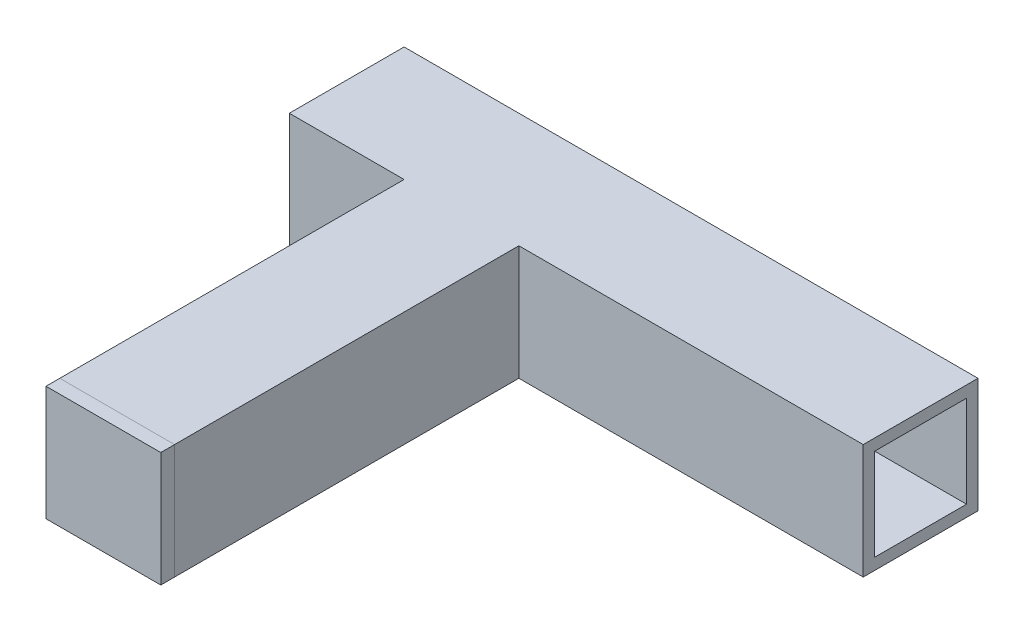
ISO-10303-21;
HEADER;
FILE_DESCRIPTION(('STEP AP214'),'2;1');
FILE_NAME('part.step','',(''),(''),'','','');
FILE_SCHEMA(('AUTOMOTIVE_DESIGN { 1 0 10303 214 1 1 1 1 }'));
ENDSEC;
DATA;
#1=APPLICATION_CONTEXT('core data for automotive mechanical design processes');
#2=APPLICATION_PROTOCOL_DEFINITION('international standard','automotive_design',2000,#1);
#3=PRODUCT_CONTEXT('',#1,'mechanical');
#4=PRODUCT('Part','Part','',(#3));
#5=PRODUCT_RELATED_PRODUCT_CATEGORY('part','',(#4));
#6=PRODUCT_DEFINITION_FORMATION('','',#4);
#7=PRODUCT_DEFINITION_CONTEXT('part definition',#1,'design');
#8=PRODUCT_DEFINITION('design','',#6,#7);
#9=PRODUCT_DEFINITION_SHAPE('','',#8);
#10=(LENGTH_UNIT() NAMED_UNIT(*) SI_UNIT(.MILLI.,.METRE.));
#11=(NAMED_UNIT(*) PLANE_ANGLE_UNIT() SI_UNIT($,.RADIAN.));
#12=(NAMED_UNIT(*) SI_UNIT($,.STERADIAN.) SOLID_ANGLE_UNIT());
#13=UNCERTAINTY_MEASURE_WITH_UNIT(LENGTH_MEASURE(1.E-05),#10,'distance_accuracy_value','');
#14=(GEOMETRIC_REPRESENTATION_CONTEXT(3) GLOBAL_UNCERTAINTY_ASSIGNED_CONTEXT((#13)) GLOBAL_UNIT_ASSIGNED_CONTEXT((#10,
#11,#12)) REPRESENTATION_CONTEXT('',''));
#15=CARTESIAN_POINT('',(0.,0.,0.));
#16=DIRECTION('',(0.,0.,1.));
#17=DIRECTION('',(1.,0.,0.));
#18=AXIS2_PLACEMENT_3D('',#15,#16,#17);
#19=CARTESIAN_POINT('',(125.,175.,25.));
#20=DIRECTION('',(0.,0.,1.));
#21=DIRECTION('',(1.,0.,0.));
#22=AXIS2_PLACEMENT_3D('',#19,#20,#21);
#23=PLANE('',#22);
#24=DIRECTION('',(0.,-1.,0.));
#25=VECTOR('',#24,1.);
#26=CARTESIAN_POINT('',(175.,225.,25.));
#27=LINE('',#26,#25);
#28=CARTESIAN_POINT('',(175.,225.,25.));
#29=VERTEX_POINT('',#28);
#30=CARTESIAN_POINT('',(175.,175.,25.));
#31=VERTEX_POINT('',#30);
#32=EDGE_CURVE('E66',#29,#31,#27,.T.);
#33=ORIENTED_EDGE('',*,*,#32,.F.);
#34=DIRECTION('',(1.,0.,0.));
#35=VECTOR('',#34,1.);
#36=CARTESIAN_POINT('',(125.,225.,25.));
#37=LINE('',#36,#35);
#38=CARTESIAN_POINT('',(125.,225.,25.));
#39=VERTEX_POINT('',#38);
#40=EDGE_CURVE('E334',#39,#29,#37,.T.);
#41=ORIENTED_EDGE('',*,*,#40,.F.);
#42=DIRECTION('',(0.,-1.,0.));
#43=VECTOR('',#42,1.);
#44=CARTESIAN_POINT('',(125.,175.,25.));
#45=LINE('',#44,#43);
#46=CARTESIAN_POINT('',(125.,175.,25.));
#47=VERTEX_POINT('',#46);
#48=EDGE_CURVE('E330',#39,#47,#45,.T.);
#49=ORIENTED_EDGE('',*,*,#48,.T.);
#50=DIRECTION('',(1.,0.,0.));
#51=VECTOR('',#50,1.);
#52=CARTESIAN_POINT('',(125.,175.,25.));
#53=LINE('',#52,#51);
#54=EDGE_CURVE('E11',#47,#31,#53,.T.);
#55=ORIENTED_EDGE('',*,*,#54,.T.);
#56=EDGE_LOOP('',(#33,#41,#49,#55));
#57=FACE_BOUND('',#56,.T.);
#58=ADVANCED_FACE('F39',(#57),#23,.T.);
#59=CARTESIAN_POINT('',(125.,175.,25.));
#60=DIRECTION('',(0.,-1.,0.));
#61=DIRECTION('',(0.,0.,-1.));
#62=AXIS2_PLACEMENT_3D('',#59,#60,#61);
#63=PLANE('',#62);
#64=DIRECTION('',(1.,0.,0.));
#65=VECTOR('',#64,1.);
#66=CARTESIAN_POINT('',(125.,175.,-25.));
#67=LINE('',#66,#65);
#68=CARTESIAN_POINT('',(125.,175.,-25.));
#69=VERTEX_POINT('',#68);
#70=CARTESIAN_POINT('',(375.,175.,-24.9999999999999));
#71=VERTEX_POINT('',#70);
#72=EDGE_CURVE('E332',#69,#71,#67,.T.);
#73=ORIENTED_EDGE('',*,*,#72,.T.);
#74=DIRECTION('',(0.,0.,-1.));
#75=VECTOR('',#74,1.);
#76=CARTESIAN_POINT('',(375.,175.,25.));
#77=LINE('',#76,#75);
#78=CARTESIAN_POINT('',(375.,175.,25.));
#79=VERTEX_POINT('',#78);
#80=EDGE_CURVE('E289',#79,#71,#77,.T.);
#81=ORIENTED_EDGE('',*,*,#80,.F.);
#82=CARTESIAN_POINT('',(225.,175.,25.));
#83=VERTEX_POINT('',#82);
#84=EDGE_CURVE('E51',#83,#79,#53,.T.);
#85=ORIENTED_EDGE('',*,*,#84,.F.);
#86=DIRECTION('',(0.,0.,-1.));
#87=VECTOR('',#86,1.);
#88=CARTESIAN_POINT('',(225.,175.,175.));
#89=LINE('',#88,#87);
#90=CARTESIAN_POINT('',(224.999975,175.000025,175.));
#91=VERTEX_POINT('',#90);
#92=EDGE_CURVE('E272',#91,#83,#89,.T.);
#93=ORIENTED_EDGE('',*,*,#92,.F.);
#94=CARTESIAN_POINT('',(175.00005,175.00005,175.));
#95=DIRECTION('',(1.,0.,0.));
#96=VECTOR('',#95,1.);
#97=LINE('',#94,#96);
#98=CARTESIAN_POINT('',(175.000025,175.000025,175.));
#99=VERTEX_POINT('',#98);
#100=EDGE_CURVE('E480',#99,#91,#97,.T.);
#101=ORIENTED_EDGE('',*,*,#100,.F.);
#102=DIRECTION('',(0.,0.,-1.));
#103=VECTOR('',#102,1.);
#104=CARTESIAN_POINT('',(175.,175.,175.));
#105=LINE('',#104,#103);
#106=EDGE_CURVE('E280',#99,#31,#105,.T.);
#107=ORIENTED_EDGE('',*,*,#106,.T.);
#108=ORIENTED_EDGE('',*,*,#54,.F.);
#109=DIRECTION('',(0.,0.,-1.));
#110=VECTOR('',#109,1.);
#111=CARTESIAN_POINT('',(125.,175.,25.));
#112=LINE('',#111,#110);
#113=EDGE_CURVE('E316',#47,#69,#112,.T.);
#114=ORIENTED_EDGE('',*,*,#113,.T.);
#115=EDGE_LOOP('',(#73,#81,#85,#93,#101,#107,#108,#114));
#116=FACE_BOUND('',#115,.T.);
#117=ADVANCED_FACE('F41',(#116),#63,.T.);
#118=DIRECTION('',(0.,1.,0.));
#119=VECTOR('',#118,1.);
#120=CARTESIAN_POINT('',(225.,225.,25.));
#121=LINE('',#120,#119);
#122=CARTESIAN_POINT('',(225.,225.,25.));
#123=VERTEX_POINT('',#122);
#124=EDGE_CURVE('E379',#83,#123,#121,.T.);
#125=ORIENTED_EDGE('',*,*,#124,.F.);
#126=ORIENTED_EDGE('',*,*,#84,.T.);
#127=DIRECTION('',(0.,-1.,0.));
#128=VECTOR('',#127,1.);
#129=CARTESIAN_POINT('',(375.,175.,25.));
#130=LINE('',#129,#128);
#131=CARTESIAN_POINT('',(375.,225.,25.0000000000001));
#132=VERTEX_POINT('',#131);
#133=EDGE_CURVE('E298',#132,#79,#130,.T.);
#134=ORIENTED_EDGE('',*,*,#133,.F.);
#135=EDGE_CURVE('E336',#123,#132,#37,.T.);
#136=ORIENTED_EDGE('',*,*,#135,.F.);
#137=EDGE_LOOP('',(#125,#126,#134,#136));
#138=FACE_BOUND('',#137,.T.);
#139=ADVANCED_FACE('F356',(#138),#23,.T.);
#140=CARTESIAN_POINT('',(125.,225.,25.));
#141=DIRECTION('',(0.,1.,0.));
#142=DIRECTION('',(0.,0.,1.));
#143=AXIS2_PLACEMENT_3D('',#140,#141,#142);
#144=PLANE('',#143);
#145=ORIENTED_EDGE('',*,*,#40,.T.);
#146=DIRECTION('',(0.,0.,-1.));
#147=VECTOR('',#146,1.);
#148=CARTESIAN_POINT('',(175.,225.,175.));
#149=LINE('',#148,#147);
#150=CARTESIAN_POINT('',(175.000025,224.999975,175.));
#151=VERTEX_POINT('',#150);
#152=EDGE_CURVE('E273',#151,#29,#149,.T.);
#153=ORIENTED_EDGE('',*,*,#152,.F.);
#154=CARTESIAN_POINT('',(224.99995,224.99995,175.));
#155=DIRECTION('',(-1.,0.,0.));
#156=VECTOR('',#155,1.);
#157=LINE('',#154,#156);
#158=CARTESIAN_POINT('',(224.999975,224.999975,175.));
#159=VERTEX_POINT('',#158);
#160=EDGE_CURVE('E212',#159,#151,#157,.T.);
#161=ORIENTED_EDGE('',*,*,#160,.F.);
#162=DIRECTION('',(0.,0.,-1.));
#163=VECTOR('',#162,1.);
#164=CARTESIAN_POINT('',(225.,225.,175.));
#165=LINE('',#164,#163);
#166=EDGE_CURVE('E264',#159,#123,#165,.T.);
#167=ORIENTED_EDGE('',*,*,#166,.T.);
#168=ORIENTED_EDGE('',*,*,#135,.T.);
#169=DIRECTION('',(0.,0.,1.));
#170=VECTOR('',#169,1.);
#171=CARTESIAN_POINT('',(375.,225.,25.0000000000001));
#172=LINE('',#171,#170);
#173=CARTESIAN_POINT('',(375.,225.,-24.9999999999999));
#174=VERTEX_POINT('',#173);
#175=EDGE_CURVE('E295',#174,#132,#172,.T.);
#176=ORIENTED_EDGE('',*,*,#175,.F.);
#177=DIRECTION('',(1.,0.,0.));
#178=VECTOR('',#177,1.);
#179=CARTESIAN_POINT('',(125.,225.,-24.9999999999999));
#180=LINE('',#179,#178);
#181=CARTESIAN_POINT('',(125.,225.,-24.9999999999999));
#182=VERTEX_POINT('',#181);
#183=EDGE_CURVE('E337',#182,#174,#180,.T.);
#184=ORIENTED_EDGE('',*,*,#183,.F.);
#185=DIRECTION('',(0.,0.,1.));
#186=VECTOR('',#185,1.);
#187=CARTESIAN_POINT('',(125.,225.,25.));
#188=LINE('',#187,#186);
#189=EDGE_CURVE('E327',#182,#39,#188,.T.);
#190=ORIENTED_EDGE('',*,*,#189,.T.);
#191=EDGE_LOOP('',(#145,#153,#161,#167,#168,#176,#184,#190));
#192=FACE_BOUND('',#191,.T.);
#193=ADVANCED_FACE('F346',(#192),#144,.T.);
#194=CARTESIAN_POINT('',(125.,175.,-25.));
#195=DIRECTION('',(0.,0.,-1.));
#196=DIRECTION('',(-1.,0.,0.));
#197=AXIS2_PLACEMENT_3D('',#194,#195,#196);
#198=PLANE('',#197);
#199=ORIENTED_EDGE('',*,*,#183,.T.);
#200=DIRECTION('',(0.,1.,0.));
#201=VECTOR('',#200,1.);
#202=CARTESIAN_POINT('',(375.,175.,-24.9999999999999));
#203=LINE('',#202,#201);
#204=EDGE_CURVE('E292',#71,#174,#203,.T.);
#205=ORIENTED_EDGE('',*,*,#204,.F.);
#206=ORIENTED_EDGE('',*,*,#72,.F.);
#207=DIRECTION('',(0.,1.,0.));
#208=VECTOR('',#207,1.);
#209=CARTESIAN_POINT('',(125.,175.,-25.));
#210=LINE('',#209,#208);
#211=EDGE_CURVE('E324',#69,#182,#210,.T.);
#212=ORIENTED_EDGE('',*,*,#211,.T.);
#213=EDGE_LOOP('',(#199,#205,#206,#212));
#214=FACE_BOUND('',#213,.T.);
#215=ADVANCED_FACE('F355',(#214),#198,.T.);
#216=CARTESIAN_POINT('',(125.,200.,0.));
#217=DIRECTION('',(1.,0.,0.));
#218=DIRECTION('',(0.,1.,0.));
#219=AXIS2_PLACEMENT_3D('',#216,#217,#218);
#220=PLANE('',#219);
#221=DIRECTION('',(0.,0.,1.));
#222=VECTOR('',#221,1.);
#223=CARTESIAN_POINT('',(125.,220.,20.));
#224=LINE('',#223,#222);
#225=CARTESIAN_POINT('',(125.,220.,-19.9999999999999));
#226=VERTEX_POINT('',#225);
#227=CARTESIAN_POINT('',(125.,220.,20.));
#228=VERTEX_POINT('',#227);
#229=EDGE_CURVE('E310',#226,#228,#224,.T.);
#230=ORIENTED_EDGE('',*,*,#229,.T.);
#231=DIRECTION('',(0.,-1.,0.));
#232=VECTOR('',#231,1.);
#233=CARTESIAN_POINT('',(125.,180.,20.));
#234=LINE('',#233,#232);
#235=CARTESIAN_POINT('',(125.,180.,20.));
#236=VERTEX_POINT('',#235);
#237=EDGE_CURVE('E301',#228,#236,#234,.T.);
#238=ORIENTED_EDGE('',*,*,#237,.T.);
#239=DIRECTION('',(0.,0.,-1.));
#240=VECTOR('',#239,1.);
#241=CARTESIAN_POINT('',(125.,180.,20.));
#242=LINE('',#241,#240);
#243=CARTESIAN_POINT('',(125.,180.,-20.));
#244=VERTEX_POINT('',#243);
#245=EDGE_CURVE('E304',#236,#244,#242,.T.);
#246=ORIENTED_EDGE('',*,*,#245,.T.);
#247=DIRECTION('',(0.,1.,0.));
#248=VECTOR('',#247,1.);
#249=CARTESIAN_POINT('',(125.,180.,-20.));
#250=LINE('',#249,#248);
#251=EDGE_CURVE('E307',#244,#226,#250,.T.);
#252=ORIENTED_EDGE('',*,*,#251,.T.);
#253=EDGE_LOOP('',(#230,#238,#246,#252));
#254=FACE_BOUND('',#253,.T.);
#255=ORIENTED_EDGE('',*,*,#113,.F.);
#256=ORIENTED_EDGE('',*,*,#48,.F.);
#257=ORIENTED_EDGE('',*,*,#189,.F.);
#258=ORIENTED_EDGE('',*,*,#211,.F.);
#259=EDGE_LOOP('',(#255,#256,#257,#258));
#260=FACE_BOUND('',#259,.T.);
#261=ADVANCED_FACE('F359',(#254,#260),#220,.F.);
#262=CARTESIAN_POINT('',(125.,180.,20.));
#263=DIRECTION('',(0.,0.,1.));
#264=DIRECTION('',(1.,0.,0.));
#265=AXIS2_PLACEMENT_3D('',#262,#263,#264);
#266=PLANE('',#265);
#267=DIRECTION('',(1.,0.,0.));
#268=VECTOR('',#267,1.);
#269=CARTESIAN_POINT('',(125.,220.,20.));
#270=LINE('',#269,#268);
#271=CARTESIAN_POINT('',(375.,220.,20.0000000000001));
#272=VERTEX_POINT('',#271);
#273=EDGE_CURVE('E314',#228,#272,#270,.T.);
#274=ORIENTED_EDGE('',*,*,#273,.T.);
#275=DIRECTION('',(0.,-1.,0.));
#276=VECTOR('',#275,1.);
#277=CARTESIAN_POINT('',(375.,180.,20.0000000000001));
#278=LINE('',#277,#276);
#279=CARTESIAN_POINT('',(375.,180.,20.0000000000001));
#280=VERTEX_POINT('',#279);
#281=EDGE_CURVE('E276',#272,#280,#278,.T.);
#282=ORIENTED_EDGE('',*,*,#281,.T.);
#283=DIRECTION('',(1.,0.,0.));
#284=VECTOR('',#283,1.);
#285=CARTESIAN_POINT('',(125.,180.,20.));
#286=LINE('',#285,#284);
#287=EDGE_CURVE('E313',#236,#280,#286,.T.);
#288=ORIENTED_EDGE('',*,*,#287,.F.);
#289=ORIENTED_EDGE('',*,*,#237,.F.);
#290=EDGE_LOOP('',(#274,#282,#288,#289));
#291=FACE_BOUND('',#290,.T.);
#292=ADVANCED_FACE('F364',(#291),#266,.F.);
#293=CARTESIAN_POINT('',(125.,220.,20.));
#294=DIRECTION('',(0.,1.,0.));
#295=DIRECTION('',(0.,0.,1.));
#296=AXIS2_PLACEMENT_3D('',#293,#294,#295);
#297=PLANE('',#296);
#298=DIRECTION('',(1.,0.,0.));
#299=VECTOR('',#298,1.);
#300=CARTESIAN_POINT('',(125.,220.,-19.9999999999999));
#301=LINE('',#300,#299);
#302=CARTESIAN_POINT('',(375.,220.,-19.9999999999999));
#303=VERTEX_POINT('',#302);
#304=EDGE_CURVE('E317',#226,#303,#301,.T.);
#305=ORIENTED_EDGE('',*,*,#304,.T.);
#306=DIRECTION('',(0.,0.,1.));
#307=VECTOR('',#306,1.);
#308=CARTESIAN_POINT('',(375.,220.,20.0000000000001));
#309=LINE('',#308,#307);
#310=EDGE_CURVE('E286',#303,#272,#309,.T.);
#311=ORIENTED_EDGE('',*,*,#310,.T.);
#312=ORIENTED_EDGE('',*,*,#273,.F.);
#313=ORIENTED_EDGE('',*,*,#229,.F.);
#314=EDGE_LOOP('',(#305,#311,#312,#313));
#315=FACE_BOUND('',#314,.T.);
#316=ADVANCED_FACE('F504',(#315),#297,.F.);
#317=CARTESIAN_POINT('',(125.,180.,-20.));
#318=DIRECTION('',(0.,0.,-1.));
#319=DIRECTION('',(-1.,0.,0.));
#320=AXIS2_PLACEMENT_3D('',#317,#318,#319);
#321=PLANE('',#320);
#322=DIRECTION('',(1.,0.,0.));
#323=VECTOR('',#322,1.);
#324=CARTESIAN_POINT('',(125.,180.,-20.));
#325=LINE('',#324,#323);
#326=CARTESIAN_POINT('',(375.,180.,-19.9999999999999));
#327=VERTEX_POINT('',#326);
#328=EDGE_CURVE('E319',#244,#327,#325,.T.);
#329=ORIENTED_EDGE('',*,*,#328,.T.);
#330=DIRECTION('',(0.,1.,0.));
#331=VECTOR('',#330,1.);
#332=CARTESIAN_POINT('',(375.,180.,-19.9999999999999));
#333=LINE('',#332,#331);
#334=EDGE_CURVE('E283',#327,#303,#333,.T.);
#335=ORIENTED_EDGE('',*,*,#334,.T.);
#336=ORIENTED_EDGE('',*,*,#304,.F.);
#337=ORIENTED_EDGE('',*,*,#251,.F.);
#338=EDGE_LOOP('',(#329,#335,#336,#337));
#339=FACE_BOUND('',#338,.T.);
#340=ADVANCED_FACE('F506',(#339),#321,.F.);
#341=CARTESIAN_POINT('',(125.,180.,20.));
#342=DIRECTION('',(0.,-1.,0.));
#343=DIRECTION('',(0.,0.,-1.));
#344=AXIS2_PLACEMENT_3D('',#341,#342,#343);
#345=PLANE('',#344);
#346=ORIENTED_EDGE('',*,*,#287,.T.);
#347=DIRECTION('',(0.,0.,-1.));
#348=VECTOR('',#347,1.);
#349=CARTESIAN_POINT('',(375.,180.,20.0000000000001));
#350=LINE('',#349,#348);
#351=EDGE_CURVE('E279',#280,#327,#350,.T.);
#352=ORIENTED_EDGE('',*,*,#351,.T.);
#353=ORIENTED_EDGE('',*,*,#328,.F.);
#354=ORIENTED_EDGE('',*,*,#245,.F.);
#355=EDGE_LOOP('',(#346,#352,#353,#354));
#356=FACE_BOUND('',#355,.T.);
#357=ADVANCED_FACE('F492',(#356),#345,.F.);
#358=CARTESIAN_POINT('',(375.,200.,0.));
#359=DIRECTION('',(1.,0.,0.));
#360=DIRECTION('',(0.,1.,0.));
#361=AXIS2_PLACEMENT_3D('',#358,#359,#360);
#362=PLANE('',#361);
#363=ORIENTED_EDGE('',*,*,#80,.T.);
#364=ORIENTED_EDGE('',*,*,#204,.T.);
#365=ORIENTED_EDGE('',*,*,#175,.T.);
#366=ORIENTED_EDGE('',*,*,#133,.T.);
#367=EDGE_LOOP('',(#363,#364,#365,#366));
#368=FACE_BOUND('',#367,.T.);
#369=ORIENTED_EDGE('',*,*,#351,.F.);
#370=ORIENTED_EDGE('',*,*,#281,.F.);
#371=ORIENTED_EDGE('',*,*,#310,.F.);
#372=ORIENTED_EDGE('',*,*,#334,.F.);
#373=EDGE_LOOP('',(#369,#370,#371,#372));
#374=FACE_BOUND('',#373,.T.);
#375=ADVANCED_FACE('F489',(#368,#374),#362,.T.);
#376=CARTESIAN_POINT('',(175.,225.,175.));
#377=DIRECTION('',(1.,0.,0.));
#378=DIRECTION('',(0.,1.,0.));
#379=AXIS2_PLACEMENT_3D('',#376,#377,#378);
#380=PLANE('',#379);
#381=ORIENTED_EDGE('',*,*,#32,.T.);
#382=ORIENTED_EDGE('',*,*,#106,.F.);
#383=CARTESIAN_POINT('',(175.00005,224.99995,175.));
#384=DIRECTION('',(0.,-1.,0.));
#385=VECTOR('',#384,1.);
#386=LINE('',#383,#385);
#387=EDGE_CURVE('E383',#151,#99,#386,.T.);
#388=ORIENTED_EDGE('',*,*,#387,.F.);
#389=ORIENTED_EDGE('',*,*,#152,.T.);
#390=EDGE_LOOP('',(#381,#382,#388,#389));
#391=FACE_BOUND('',#390,.T.);
#392=ADVANCED_FACE('F254',(#391),#380,.F.);
#393=CARTESIAN_POINT('',(225.,225.,175.));
#394=DIRECTION('',(-1.,0.,0.));
#395=DIRECTION('',(0.,-1.,0.));
#396=AXIS2_PLACEMENT_3D('',#393,#394,#395);
#397=PLANE('',#396);
#398=ORIENTED_EDGE('',*,*,#124,.T.);
#399=ORIENTED_EDGE('',*,*,#166,.F.);
#400=CARTESIAN_POINT('',(224.99995,175.00005,175.));
#401=DIRECTION('',(0.,1.,0.));
#402=VECTOR('',#401,1.);
#403=LINE('',#400,#402);
#404=EDGE_CURVE('E194',#91,#159,#403,.T.);
#405=ORIENTED_EDGE('',*,*,#404,.F.);
#406=ORIENTED_EDGE('',*,*,#92,.T.);
#407=EDGE_LOOP('',(#398,#399,#405,#406));
#408=FACE_BOUND('',#407,.T.);
#409=ADVANCED_FACE('F233',(#408),#397,.F.);
#410=CARTESIAN_POINT('',(224.99995,175.00005,181.));
#411=DIRECTION('',(-1.,0.,0.));
#412=DIRECTION('',(0.,0.,1.));
#413=AXIS2_PLACEMENT_3D('',#410,#411,#412);
#414=PLANE('',#413);
#415=ORIENTED_EDGE('',*,*,#404,.T.);
#416=DIRECTION('',(0.,0.,-1.));
#417=VECTOR('',#416,1.);
#418=CARTESIAN_POINT('',(224.99995,224.99995,181.));
#419=LINE('',#418,#417);
#420=CARTESIAN_POINT('',(224.99995,224.99995,181.));
#421=VERTEX_POINT('',#420);
#422=EDGE_CURVE('E175',#421,#159,#419,.T.);
#423=ORIENTED_EDGE('',*,*,#422,.F.);
#424=DIRECTION('',(0.,1.,0.));
#425=VECTOR('',#424,1.);
#426=CARTESIAN_POINT('',(224.99995,175.00005,181.));
#427=LINE('',#426,#425);
#428=CARTESIAN_POINT('',(224.99995,175.00005,181.));
#429=VERTEX_POINT('',#428);
#430=EDGE_CURVE('E182',#429,#421,#427,.T.);
#431=ORIENTED_EDGE('',*,*,#430,.F.);
#432=DIRECTION('',(0.,0.,-1.));
#433=VECTOR('',#432,1.);
#434=CARTESIAN_POINT('',(224.99995,175.00005,181.));
#435=LINE('',#434,#433);
#436=EDGE_CURVE('E454',#429,#91,#435,.T.);
#437=ORIENTED_EDGE('',*,*,#436,.T.);
#438=EDGE_LOOP('',(#415,#423,#431,#437));
#439=FACE_BOUND('',#438,.T.);
#440=ADVANCED_FACE('F192',(#439),#414,.F.);
#441=CARTESIAN_POINT('',(175.00005,224.99995,181.));
#442=DIRECTION('',(0.,-1.,0.));
#443=DIRECTION('',(0.,0.,-1.));
#444=AXIS2_PLACEMENT_3D('',#441,#442,#443);
#445=PLANE('',#444);
#446=ORIENTED_EDGE('',*,*,#160,.T.);
#447=DIRECTION('',(0.,0.,-1.));
#448=VECTOR('',#447,1.);
#449=CARTESIAN_POINT('',(175.00005,224.99995,181.));
#450=LINE('',#449,#448);
#451=CARTESIAN_POINT('',(175.00005,224.99995,181.));
#452=VERTEX_POINT('',#451);
#453=EDGE_CURVE('E178',#452,#151,#450,.T.);
#454=ORIENTED_EDGE('',*,*,#453,.F.);
#455=DIRECTION('',(-1.,0.,0.));
#456=VECTOR('',#455,1.);
#457=CARTESIAN_POINT('',(175.00005,224.99995,181.));
#458=LINE('',#457,#456);
#459=EDGE_CURVE('E170',#421,#452,#458,.T.);
#460=ORIENTED_EDGE('',*,*,#459,.F.);
#461=ORIENTED_EDGE('',*,*,#422,.T.);
#462=EDGE_LOOP('',(#446,#454,#460,#461));
#463=FACE_BOUND('',#462,.T.);
#464=ADVANCED_FACE('F173',(#463),#445,.F.);
#465=CARTESIAN_POINT('',(175.00005,175.00005,181.));
#466=DIRECTION('',(1.,0.,0.));
#467=DIRECTION('',(0.,0.,-1.));
#468=AXIS2_PLACEMENT_3D('',#465,#466,#467);
#469=PLANE('',#468);
#470=ORIENTED_EDGE('',*,*,#387,.T.);
#471=DIRECTION('',(0.,0.,-1.));
#472=VECTOR('',#471,1.);
#473=CARTESIAN_POINT('',(175.00005,175.00005,181.));
#474=LINE('',#473,#472);
#475=CARTESIAN_POINT('',(175.00005,175.00005,181.));
#476=VERTEX_POINT('',#475);
#477=EDGE_CURVE('E201',#476,#99,#474,.T.);
#478=ORIENTED_EDGE('',*,*,#477,.F.);
#479=DIRECTION('',(0.,-1.,0.));
#480=VECTOR('',#479,1.);
#481=CARTESIAN_POINT('',(175.00005,175.00005,181.));
#482=LINE('',#481,#480);
#483=EDGE_CURVE('E181',#452,#476,#482,.T.);
#484=ORIENTED_EDGE('',*,*,#483,.F.);
#485=ORIENTED_EDGE('',*,*,#453,.T.);
#486=EDGE_LOOP('',(#470,#478,#484,#485));
#487=FACE_BOUND('',#486,.T.);
#488=ADVANCED_FACE('F227',(#487),#469,.F.);
#489=CARTESIAN_POINT('',(175.00005,175.00005,181.));
#490=DIRECTION('',(0.,1.,0.));
#491=DIRECTION('',(0.,0.,1.));
#492=AXIS2_PLACEMENT_3D('',#489,#490,#491);
#493=PLANE('',#492);
#494=ORIENTED_EDGE('',*,*,#100,.T.);
#495=ORIENTED_EDGE('',*,*,#436,.F.);
#496=DIRECTION('',(1.,0.,0.));
#497=VECTOR('',#496,1.);
#498=CARTESIAN_POINT('',(175.00005,175.00005,181.));
#499=LINE('',#498,#497);
#500=EDGE_CURVE('E187',#476,#429,#499,.T.);
#501=ORIENTED_EDGE('',*,*,#500,.F.);
#502=ORIENTED_EDGE('',*,*,#477,.T.);
#503=EDGE_LOOP('',(#494,#495,#501,#502));
#504=FACE_BOUND('',#503,.T.);
#505=ADVANCED_FACE('F444',(#504),#493,.F.);
#506=CARTESIAN_POINT('',(200.,200.,181.));
#507=DIRECTION('',(0.,0.,-1.));
#508=DIRECTION('',(-1.,0.,0.));
#509=AXIS2_PLACEMENT_3D('',#506,#507,#508);
#510=PLANE('',#509);
#511=ORIENTED_EDGE('',*,*,#430,.T.);
#512=ORIENTED_EDGE('',*,*,#459,.T.);
#513=ORIENTED_EDGE('',*,*,#483,.T.);
#514=ORIENTED_EDGE('',*,*,#500,.T.);
#515=EDGE_LOOP('',(#511,#512,#513,#514));
#516=FACE_BOUND('',#515,.T.);
#517=ADVANCED_FACE('F185',(#516),#510,.F.);
#518=CLOSED_SHELL('',(#58,#117,#139,#193,#215,#261,#292,#316,#340,#357,#375,#392,#409,#440,#464,
#488,#505,#517));
#519=DIRECTION('',(0.,1.,0.));
#520=VECTOR('',#519,1.);
#521=CARTESIAN_POINT('',(220.,220.,25.));
#522=LINE('',#521,#520);
#523=CARTESIAN_POINT('',(220.,180.,25.));
#524=VERTEX_POINT('',#523);
#525=CARTESIAN_POINT('',(220.,220.,25.));
#526=VERTEX_POINT('',#525);
#527=EDGE_CURVE('E420',#524,#526,#522,.T.);
#528=ORIENTED_EDGE('',*,*,#527,.T.);
#529=DIRECTION('',(-1.,0.,0.));
#530=VECTOR('',#529,1.);
#531=CARTESIAN_POINT('',(180.,220.,25.));
#532=LINE('',#531,#530);
#533=CARTESIAN_POINT('',(180.,220.,25.));
#534=VERTEX_POINT('',#533);
#535=EDGE_CURVE('E196',#526,#534,#532,.T.);
#536=ORIENTED_EDGE('',*,*,#535,.T.);
#537=DIRECTION('',(0.,-1.,0.));
#538=VECTOR('',#537,1.);
#539=CARTESIAN_POINT('',(180.,220.,25.));
#540=LINE('',#539,#538);
#541=CARTESIAN_POINT('',(180.,180.,25.));
#542=VERTEX_POINT('',#541);
#543=EDGE_CURVE('E199',#534,#542,#540,.T.);
#544=ORIENTED_EDGE('',*,*,#543,.T.);
#545=DIRECTION('',(1.,0.,0.));
#546=VECTOR('',#545,1.);
#547=CARTESIAN_POINT('',(180.,180.,25.));
#548=LINE('',#547,#546);
#549=EDGE_CURVE('E423',#542,#524,#548,.T.);
#550=ORIENTED_EDGE('',*,*,#549,.T.);
#551=EDGE_LOOP('',(#528,#536,#544,#550));
#552=FACE_BOUND('',#551,.T.);
#553=ADVANCED_FACE('F367',(#552),#23,.T.);
#554=CARTESIAN_POINT('',(200.,200.,175.));
#555=DIRECTION('',(0.,0.,-1.));
#556=DIRECTION('',(-1.,0.,0.));
#557=AXIS2_PLACEMENT_3D('',#554,#555,#556);
#558=PLANE('',#557);
#559=DIRECTION('',(0.,-1.,0.));
#560=VECTOR('',#559,1.);
#561=CARTESIAN_POINT('',(180.,220.,175.));
#562=LINE('',#561,#560);
#563=CARTESIAN_POINT('',(180.,220.,175.));
#564=VERTEX_POINT('',#563);
#565=CARTESIAN_POINT('',(180.,180.,175.));
#566=VERTEX_POINT('',#565);
#567=EDGE_CURVE('E431',#564,#566,#562,.T.);
#568=ORIENTED_EDGE('',*,*,#567,.F.);
#569=DIRECTION('',(-1.,0.,0.));
#570=VECTOR('',#569,1.);
#571=CARTESIAN_POINT('',(180.,220.,175.));
#572=LINE('',#571,#570);
#573=CARTESIAN_POINT('',(220.,220.,175.));
#574=VERTEX_POINT('',#573);
#575=EDGE_CURVE('E217',#574,#564,#572,.T.);
#576=ORIENTED_EDGE('',*,*,#575,.F.);
#577=DIRECTION('',(0.,1.,0.));
#578=VECTOR('',#577,1.);
#579=CARTESIAN_POINT('',(220.,220.,175.));
#580=LINE('',#579,#578);
#581=CARTESIAN_POINT('',(220.,180.,175.));
#582=VERTEX_POINT('',#581);
#583=EDGE_CURVE('E419',#582,#574,#580,.T.);
#584=ORIENTED_EDGE('',*,*,#583,.F.);
#585=DIRECTION('',(1.,0.,0.));
#586=VECTOR('',#585,1.);
#587=CARTESIAN_POINT('',(180.,180.,175.));
#588=LINE('',#587,#586);
#589=EDGE_CURVE('E429',#566,#582,#588,.T.);
#590=ORIENTED_EDGE('',*,*,#589,.F.);
#591=EDGE_LOOP('',(#568,#576,#584,#590));
#592=FACE_BOUND('',#591,.T.);
#593=ADVANCED_FACE('F238',(#592),#558,.T.);
#594=CARTESIAN_POINT('',(220.,220.,175.));
#595=DIRECTION('',(-1.,0.,0.));
#596=DIRECTION('',(0.,-1.,0.));
#597=AXIS2_PLACEMENT_3D('',#594,#595,#596);
#598=PLANE('',#597);
#599=ORIENTED_EDGE('',*,*,#527,.F.);
#600=DIRECTION('',(0.,0.,-1.));
#601=VECTOR('',#600,1.);
#602=CARTESIAN_POINT('',(220.,180.,175.));
#603=LINE('',#602,#601);
#604=EDGE_CURVE('E416',#582,#524,#603,.T.);
#605=ORIENTED_EDGE('',*,*,#604,.F.);
#606=ORIENTED_EDGE('',*,*,#583,.T.);
#607=DIRECTION('',(0.,0.,-1.));
#608=VECTOR('',#607,1.);
#609=CARTESIAN_POINT('',(220.,220.,175.));
#610=LINE('',#609,#608);
#611=EDGE_CURVE('E59',#574,#526,#610,.T.);
#612=ORIENTED_EDGE('',*,*,#611,.T.);
#613=EDGE_LOOP('',(#599,#605,#606,#612));
#614=FACE_BOUND('',#613,.T.);
#615=ADVANCED_FACE('F234',(#614),#598,.T.);
#616=CARTESIAN_POINT('',(180.,180.,175.));
#617=DIRECTION('',(0.,1.,0.));
#618=DIRECTION('',(0.,0.,1.));
#619=AXIS2_PLACEMENT_3D('',#616,#617,#618);
#620=PLANE('',#619);
#621=ORIENTED_EDGE('',*,*,#549,.F.);
#622=DIRECTION('',(0.,0.,-1.));
#623=VECTOR('',#622,1.);
#624=CARTESIAN_POINT('',(180.,180.,175.));
#625=LINE('',#624,#623);
#626=EDGE_CURVE('E414',#566,#542,#625,.T.);
#627=ORIENTED_EDGE('',*,*,#626,.F.);
#628=ORIENTED_EDGE('',*,*,#589,.T.);
#629=ORIENTED_EDGE('',*,*,#604,.T.);
#630=EDGE_LOOP('',(#621,#627,#628,#629));
#631=FACE_BOUND('',#630,.T.);
#632=ADVANCED_FACE('F237',(#631),#620,.T.);
#633=CARTESIAN_POINT('',(180.,220.,175.));
#634=DIRECTION('',(1.,0.,0.));
#635=DIRECTION('',(0.,1.,0.));
#636=AXIS2_PLACEMENT_3D('',#633,#634,#635);
#637=PLANE('',#636);
#638=ORIENTED_EDGE('',*,*,#543,.F.);
#639=DIRECTION('',(0.,0.,-1.));
#640=VECTOR('',#639,1.);
#641=CARTESIAN_POINT('',(180.,220.,175.));
#642=LINE('',#641,#640);
#643=EDGE_CURVE('E411',#564,#534,#642,.T.);
#644=ORIENTED_EDGE('',*,*,#643,.F.);
#645=ORIENTED_EDGE('',*,*,#567,.T.);
#646=ORIENTED_EDGE('',*,*,#626,.T.);
#647=EDGE_LOOP('',(#638,#644,#645,#646));
#648=FACE_BOUND('',#647,.T.);
#649=ADVANCED_FACE('F242',(#648),#637,.T.);
#650=CARTESIAN_POINT('',(180.,220.,175.));
#651=DIRECTION('',(0.,-1.,0.));
#652=DIRECTION('',(0.,0.,-1.));
#653=AXIS2_PLACEMENT_3D('',#650,#651,#652);
#654=PLANE('',#653);
#655=ORIENTED_EDGE('',*,*,#535,.F.);
#656=ORIENTED_EDGE('',*,*,#611,.F.);
#657=ORIENTED_EDGE('',*,*,#575,.T.);
#658=ORIENTED_EDGE('',*,*,#643,.T.);
#659=EDGE_LOOP('',(#655,#656,#657,#658));
#660=FACE_BOUND('',#659,.T.);
#661=ADVANCED_FACE('F246',(#660),#654,.T.);
#662=CLOSED_SHELL('',(#553,#593,#615,#632,#649,#661));
#663=ORIENTED_CLOSED_SHELL('',*,#662,.T.);
#664=BREP_WITH_VOIDS('B2',#518,(#663));
#665=ADVANCED_BREP_SHAPE_REPRESENTATION('',(#18,#664),#14);
#666=SHAPE_DEFINITION_REPRESENTATION(#9,#665);
ENDSEC;
END-ISO-10303-21;
